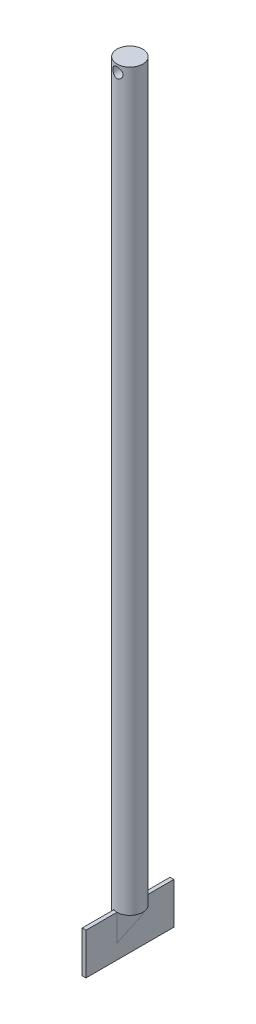
ISO-10303-21;
HEADER;
FILE_DESCRIPTION(('STEP AP214'),'2;1');
FILE_NAME('part.step','',(''),(''),'','','');
FILE_SCHEMA(('AUTOMOTIVE_DESIGN { 1 0 10303 214 1 1 1 1 }'));
ENDSEC;
DATA;
#1=APPLICATION_CONTEXT('core data for automotive mechanical design processes');
#2=APPLICATION_PROTOCOL_DEFINITION('international standard','automotive_design',2000,#1);
#3=PRODUCT_CONTEXT('',#1,'mechanical');
#4=PRODUCT('Part','Part','',(#3));
#5=PRODUCT_RELATED_PRODUCT_CATEGORY('part','',(#4));
#6=PRODUCT_DEFINITION_FORMATION('','',#4);
#7=PRODUCT_DEFINITION_CONTEXT('part definition',#1,'design');
#8=PRODUCT_DEFINITION('design','',#6,#7);
#9=PRODUCT_DEFINITION_SHAPE('','',#8);
#10=(LENGTH_UNIT() NAMED_UNIT(*) SI_UNIT(.MILLI.,.METRE.));
#11=(NAMED_UNIT(*) PLANE_ANGLE_UNIT() SI_UNIT($,.RADIAN.));
#12=(NAMED_UNIT(*) SI_UNIT($,.STERADIAN.) SOLID_ANGLE_UNIT());
#13=UNCERTAINTY_MEASURE_WITH_UNIT(LENGTH_MEASURE(1.E-05),#10,'distance_accuracy_value','');
#14=(GEOMETRIC_REPRESENTATION_CONTEXT(3) GLOBAL_UNCERTAINTY_ASSIGNED_CONTEXT((#13)) GLOBAL_UNIT_ASSIGNED_CONTEXT((#10,
#11,#12)) REPRESENTATION_CONTEXT('',''));
#15=CARTESIAN_POINT('',(0.,0.,0.));
#16=DIRECTION('',(0.,0.,1.));
#17=DIRECTION('',(1.,0.,0.));
#18=AXIS2_PLACEMENT_3D('',#15,#16,#17);
#19=CARTESIAN_POINT('',(-0.7366,8.,-2.5));
#20=DIRECTION('',(0.,1.,0.));
#21=DIRECTION('',(0.,0.,1.));
#22=AXIS2_PLACEMENT_3D('',#19,#20,#21);
#23=PLANE('',#22);
#24=DIRECTION('',(0.,0.,1.));
#25=VECTOR('',#24,1.);
#26=CARTESIAN_POINT('',(0.,8.,-2.5));
#27=LINE('',#26,#25);
#28=CARTESIAN_POINT('',(0.,8.,-8.5));
#29=VERTEX_POINT('',#28);
#30=CARTESIAN_POINT('',(0.,8.,8.5));
#31=VERTEX_POINT('',#30);
#32=EDGE_CURVE('E107',#29,#31,#27,.T.);
#33=ORIENTED_EDGE('',*,*,#32,.F.);
#34=DIRECTION('',(1.,0.,0.));
#35=VECTOR('',#34,1.);
#36=CARTESIAN_POINT('',(-0.7366,8.,-8.5));
#37=LINE('',#36,#35);
#38=CARTESIAN_POINT('',(-0.7366,8.,-8.5));
#39=VERTEX_POINT('',#38);
#40=EDGE_CURVE('E12',#39,#29,#37,.T.);
#41=ORIENTED_EDGE('',*,*,#40,.F.);
#42=DIRECTION('',(0.,0.,1.));
#43=VECTOR('',#42,1.);
#44=CARTESIAN_POINT('',(-0.7366,8.,-2.5));
#45=LINE('',#44,#43);
#46=CARTESIAN_POINT('',(-0.7366,8.,8.5));
#47=VERTEX_POINT('',#46);
#48=EDGE_CURVE('E65',#39,#47,#45,.T.);
#49=ORIENTED_EDGE('',*,*,#48,.T.);
#50=DIRECTION('',(1.,0.,0.));
#51=VECTOR('',#50,1.);
#52=CARTESIAN_POINT('',(-0.7366,8.,8.5));
#53=LINE('',#52,#51);
#54=EDGE_CURVE('E50',#47,#31,#53,.T.);
#55=ORIENTED_EDGE('',*,*,#54,.T.);
#56=EDGE_LOOP('',(#33,#41,#49,#55));
#57=FACE_BOUND('',#56,.T.);
#58=ADVANCED_FACE('F46',(#57),#23,.T.);
#59=CARTESIAN_POINT('',(-0.7366,8.,-8.5));
#60=DIRECTION('',(0.,0.,-1.));
#61=DIRECTION('',(0.,1.,0.));
#62=AXIS2_PLACEMENT_3D('',#59,#60,#61);
#63=PLANE('',#62);
#64=DIRECTION('',(0.,1.,0.));
#65=VECTOR('',#64,1.);
#66=CARTESIAN_POINT('',(0.,8.,-8.5));
#67=LINE('',#66,#65);
#68=CARTESIAN_POINT('',(0.,0.,-8.5));
#69=VERTEX_POINT('',#68);
#70=EDGE_CURVE('E114',#69,#29,#67,.T.);
#71=ORIENTED_EDGE('',*,*,#70,.F.);
#72=DIRECTION('',(1.,0.,0.));
#73=VECTOR('',#72,1.);
#74=CARTESIAN_POINT('',(-0.7366,0.,-8.5));
#75=LINE('',#74,#73);
#76=CARTESIAN_POINT('',(-0.7366,0.,-8.5));
#77=VERTEX_POINT('',#76);
#78=EDGE_CURVE('E56',#77,#69,#75,.T.);
#79=ORIENTED_EDGE('',*,*,#78,.F.);
#80=DIRECTION('',(0.,1.,0.));
#81=VECTOR('',#80,1.);
#82=CARTESIAN_POINT('',(-0.7366,8.,-8.5));
#83=LINE('',#82,#81);
#84=EDGE_CURVE('E104',#77,#39,#83,.T.);
#85=ORIENTED_EDGE('',*,*,#84,.T.);
#86=ORIENTED_EDGE('',*,*,#40,.T.);
#87=EDGE_LOOP('',(#71,#79,#85,#86));
#88=FACE_BOUND('',#87,.T.);
#89=ADVANCED_FACE('F121',(#88),#63,.T.);
#90=CARTESIAN_POINT('',(-0.7366,0.,-2.5));
#91=DIRECTION('',(0.,-1.,0.));
#92=DIRECTION('',(0.,0.,-1.));
#93=AXIS2_PLACEMENT_3D('',#90,#91,#92);
#94=PLANE('',#93);
#95=DIRECTION('',(0.,0.,-1.));
#96=VECTOR('',#95,1.);
#97=CARTESIAN_POINT('',(0.,0.,-2.5));
#98=LINE('',#97,#96);
#99=CARTESIAN_POINT('',(0.,0.,8.5));
#100=VERTEX_POINT('',#99);
#101=EDGE_CURVE('E97',#100,#69,#98,.T.);
#102=ORIENTED_EDGE('',*,*,#101,.F.);
#103=DIRECTION('',(1.,0.,0.));
#104=VECTOR('',#103,1.);
#105=CARTESIAN_POINT('',(-0.7366,0.,8.5));
#106=LINE('',#105,#104);
#107=CARTESIAN_POINT('',(-0.7366,0.,8.5));
#108=VERTEX_POINT('',#107);
#109=EDGE_CURVE('E92',#108,#100,#106,.T.);
#110=ORIENTED_EDGE('',*,*,#109,.F.);
#111=DIRECTION('',(0.,0.,-1.));
#112=VECTOR('',#111,1.);
#113=CARTESIAN_POINT('',(-0.7366,0.,2.5));
#114=LINE('',#113,#112);
#115=EDGE_CURVE('E95',#108,#77,#114,.T.);
#116=ORIENTED_EDGE('',*,*,#115,.T.);
#117=ORIENTED_EDGE('',*,*,#78,.T.);
#118=EDGE_LOOP('',(#102,#110,#116,#117));
#119=FACE_BOUND('',#118,.T.);
#120=ADVANCED_FACE('F94',(#119),#94,.T.);
#121=CARTESIAN_POINT('',(-0.7366,8.,8.5));
#122=DIRECTION('',(0.,0.,1.));
#123=DIRECTION('',(0.,-1.,0.));
#124=AXIS2_PLACEMENT_3D('',#121,#122,#123);
#125=PLANE('',#124);
#126=DIRECTION('',(0.,-1.,0.));
#127=VECTOR('',#126,1.);
#128=CARTESIAN_POINT('',(0.,8.,8.5));
#129=LINE('',#128,#127);
#130=EDGE_CURVE('E111',#31,#100,#129,.T.);
#131=ORIENTED_EDGE('',*,*,#130,.F.);
#132=ORIENTED_EDGE('',*,*,#54,.F.);
#133=DIRECTION('',(0.,-1.,0.));
#134=VECTOR('',#133,1.);
#135=CARTESIAN_POINT('',(-0.7366,8.,8.5));
#136=LINE('',#135,#134);
#137=EDGE_CURVE('E103',#47,#108,#136,.T.);
#138=ORIENTED_EDGE('',*,*,#137,.T.);
#139=ORIENTED_EDGE('',*,*,#109,.T.);
#140=EDGE_LOOP('',(#131,#132,#138,#139));
#141=FACE_BOUND('',#140,.T.);
#142=ADVANCED_FACE('F48',(#141),#125,.T.);
#143=CARTESIAN_POINT('',(-0.7366,0.,0.));
#144=DIRECTION('',(1.,0.,0.));
#145=DIRECTION('',(0.,0.,-1.));
#146=AXIS2_PLACEMENT_3D('',#143,#144,#145);
#147=PLANE('',#146);
#148=ORIENTED_EDGE('',*,*,#48,.F.);
#149=ORIENTED_EDGE('',*,*,#84,.F.);
#150=ORIENTED_EDGE('',*,*,#115,.F.);
#151=ORIENTED_EDGE('',*,*,#137,.F.);
#152=EDGE_LOOP('',(#148,#149,#150,#151));
#153=FACE_BOUND('',#152,.T.);
#154=ADVANCED_FACE('F102',(#153),#147,.F.);
#155=CARTESIAN_POINT('',(0.,0.,0.));
#156=DIRECTION('',(1.,0.,0.));
#157=DIRECTION('',(0.,0.,-1.));
#158=AXIS2_PLACEMENT_3D('',#155,#156,#157);
#159=PLANE('',#158);
#160=ORIENTED_EDGE('',*,*,#32,.T.);
#161=ORIENTED_EDGE('',*,*,#130,.T.);
#162=ORIENTED_EDGE('',*,*,#101,.T.);
#163=ORIENTED_EDGE('',*,*,#70,.T.);
#164=EDGE_LOOP('',(#160,#161,#162,#163));
#165=FACE_BOUND('',#164,.T.);
#166=ADVANCED_FACE('F119',(#165),#159,.T.);
#167=CLOSED_SHELL('',(#58,#89,#120,#142,#154,#166));
#168=MANIFOLD_SOLID_BREP('B2',#167);
#169=CARTESIAN_POINT('',(0.,150.,0.));
#170=DIRECTION('',(0.,-1.,0.));
#171=DIRECTION('',(0.,0.,-1.));
#172=AXIS2_PLACEMENT_3D('',#169,#170,#171);
#173=CYLINDRICAL_SURFACE('',#172,2.5);
#174=CARTESIAN_POINT('',(0.,149.546302439633,-2.5));
#175=CARTESIAN_POINT('',(-0.0527255858637099,149.546305134919,-2.50000207514947));
#176=CARTESIAN_POINT('',(-0.105433553720956,149.542019054617,-2.49831787136044));
#177=CARTESIAN_POINT('',(-0.209265808271871,149.525064407736,-2.49176873235837));
#178=CARTESIAN_POINT('',(-0.26039046358027,149.51239780784,-2.486904543405));
#179=CARTESIAN_POINT('',(-0.359542811859552,149.479204162292,-2.47451488340789));
#180=CARTESIAN_POINT('',(-0.407576557322328,149.458693060762,-2.46699481285942));
#181=CARTESIAN_POINT('',(-0.499515193882727,149.410477326663,-2.45003524165254));
#182=CARTESIAN_POINT('',(-0.543418880950687,149.382770605164,-2.44059518378373));
#183=CARTESIAN_POINT('',(-0.627848869642337,149.319636598682,-2.42028282429554));
#184=CARTESIAN_POINT('',(-0.668162852935495,149.283939311682,-2.40936766532367));
#185=CARTESIAN_POINT('',(-0.742406344818337,149.206410699056,-2.38753701797641));
#186=CARTESIAN_POINT('',(-0.776333650610496,149.16457726586,-2.37662153078133));
#187=CARTESIAN_POINT('',(-0.838248745092324,149.073822527169,-2.35551600890613));
#188=CARTESIAN_POINT('',(-0.865926797699143,149.024677151074,-2.34537577824783));
#189=CARTESIAN_POINT('',(-0.91252924954174,148.921971698756,-2.32764188561281));
#190=CARTESIAN_POINT('',(-0.931457484009226,148.86841356889,-2.3200471083118));
#191=CARTESIAN_POINT('',(-0.959168611328935,148.760854206648,-2.30872521216767));
#192=CARTESIAN_POINT('',(-0.968359064663309,148.706974832296,-2.3048434459503));
#193=CARTESIAN_POINT('',(-0.977607443894245,148.598309486559,-2.3009370899815));
#194=CARTESIAN_POINT('',(-0.977669565179662,148.54352394323,-2.30091072828304));
#195=CARTESIAN_POINT('',(-0.968969369987642,148.438443956723,-2.30458571629504));
#196=CARTESIAN_POINT('',(-0.960787550327517,148.388091237164,-2.30804184697979));
#197=CARTESIAN_POINT('',(-0.936796490446759,148.289540287978,-2.3178823649638));
#198=CARTESIAN_POINT('',(-0.920985999410382,148.241342413082,-2.32426723245749));
#199=CARTESIAN_POINT('',(-0.881890722768155,148.147339432819,-2.33938322459449));
#200=CARTESIAN_POINT('',(-0.858463650339298,148.101600910457,-2.3481584530494));
#201=CARTESIAN_POINT('',(-0.80489979907713,148.014541767039,-2.3670533167478));
#202=CARTESIAN_POINT('',(-0.774760571109112,147.973222766747,-2.37717344217303));
#203=CARTESIAN_POINT('',(-0.70602567101376,147.892984100266,-2.39852318013101));
#204=CARTESIAN_POINT('',(-0.666971641717412,147.854463219023,-2.40977970333551));
#205=CARTESIAN_POINT('',(-0.582834142820546,147.784393389183,-2.43149962142131));
#206=CARTESIAN_POINT('',(-0.537749584958168,147.752845701692,-2.44196287261448));
#207=CARTESIAN_POINT('',(-0.44174345396513,147.69712698137,-2.46115797284338));
#208=CARTESIAN_POINT('',(-0.390731214881055,147.673099368369,-2.46985516287567));
#209=CARTESIAN_POINT('',(-0.284963386266306,147.634102289241,-2.48427814306151));
#210=CARTESIAN_POINT('',(-0.230209620790194,147.61912844383,-2.49000536958759));
#211=CARTESIAN_POINT('',(-0.121860929217056,147.599455168135,-2.49758486012994));
#212=CARTESIAN_POINT('',(-0.068377452128324,147.594219407777,-2.49963914044596));
#213=CARTESIAN_POINT('',(0.038737769294411,147.592595667027,-2.50027300782215));
#214=CARTESIAN_POINT('',(0.0923694741655122,147.596205522941,-2.49885344460689));
#215=CARTESIAN_POINT('',(0.195871282798334,147.611770914155,-2.4928318369117));
#216=CARTESIAN_POINT('',(0.245804453714625,147.623366017249,-2.48836731440514));
#217=CARTESIAN_POINT('',(0.342974714514253,147.654088415175,-2.47684558050765));
#218=CARTESIAN_POINT('',(0.390211454896237,147.673216683901,-2.46978803389615));
#219=CARTESIAN_POINT('',(0.482250505924272,147.719082837662,-2.45350478304062));
#220=CARTESIAN_POINT('',(0.526936218009557,147.746033083683,-2.44422003819379));
#221=CARTESIAN_POINT('',(0.611305583885435,147.806541000349,-2.42449700049908));
#222=CARTESIAN_POINT('',(0.650987278433164,147.840101245939,-2.41405825880566));
#223=CARTESIAN_POINT('',(0.726841247620001,147.915358676814,-2.39235354978379));
#224=CARTESIAN_POINT('',(0.762635073863201,147.957435223587,-2.38107689048087));
#225=CARTESIAN_POINT('',(0.826739834634272,148.04720627105,-2.35958629114122));
#226=CARTESIAN_POINT('',(0.855049766200095,148.0949015235,-2.34937249365614));
#227=CARTESIAN_POINT('',(0.903500527907602,148.195143890844,-2.33117244812269));
#228=CARTESIAN_POINT('',(0.923579108273992,148.247724417483,-2.32320331198817));
#229=CARTESIAN_POINT('',(0.954450500471927,148.355922948213,-2.31069405211934));
#230=CARTESIAN_POINT('',(0.965249735215753,148.411538822913,-2.30615155682316));
#231=CARTESIAN_POINT('',(0.976657044631592,148.52009026205,-2.3013421638154));
#232=CARTESIAN_POINT('',(0.977917512568994,148.572945625426,-2.30080161737245));
#233=CARTESIAN_POINT('',(0.971908793448211,148.678075151295,-2.30334622738509));
#234=CARTESIAN_POINT('',(0.964640568139718,148.730349378648,-2.30643097502953));
#235=CARTESIAN_POINT('',(0.942304421804284,148.830913813956,-2.31564229181697));
#236=CARTESIAN_POINT('',(0.927526274188131,148.879279687546,-2.32165552824063));
#237=CARTESIAN_POINT('',(0.890854768692136,148.972868281698,-2.33597159109709));
#238=CARTESIAN_POINT('',(0.868959544815712,149.018090174174,-2.34427501789878));
#239=CARTESIAN_POINT('',(0.817269077222448,149.106839013707,-2.36280847090191));
#240=CARTESIAN_POINT('',(0.787102893020835,149.150132679846,-2.37311983427258));
#241=CARTESIAN_POINT('',(0.720280965049875,149.231250513625,-2.39424777309725));
#242=CARTESIAN_POINT('',(0.683623072829942,149.269072862964,-2.40506451493262));
#243=CARTESIAN_POINT('',(0.60220417412026,149.340523287063,-2.426773022914));
#244=CARTESIAN_POINT('',(0.557086423540308,149.373757531864,-2.43762950556742));
#245=CARTESIAN_POINT('',(0.461521884618376,149.43217574759,-2.4575147327931));
#246=CARTESIAN_POINT('',(0.411073891484605,149.457357893304,-2.46654306279831));
#247=CARTESIAN_POINT('',(0.30202274574261,149.500411857569,-2.48234666795525));
#248=CARTESIAN_POINT('',(0.243090132163681,149.51754571738,-2.48888653645957));
#249=CARTESIAN_POINT('',(0.1227626870862,149.540485921172,-2.49771067291033));
#250=CARTESIAN_POINT('',(0.0613694094937344,149.546299302483,-2.49999758465088));
#251=CARTESIAN_POINT('',(0.,149.546302439633,-2.5));
#252=B_SPLINE_CURVE_WITH_KNOTS('',3,(#174,#175,#176,#177,#178,#179,#180,#181,#182,#183,#184,
#185,#186,#187,#188,#189,#190,#191,#192,#193,#194,#195,#196,#197,#198,#199,#200,#201,#202,#203,
#204,#205,#206,#207,#208,#209,#210,#211,#212,#213,#214,#215,#216,#217,#218,#219,#220,#221,#222,
#223,#224,#225,#226,#227,#228,#229,#230,#231,#232,#233,#234,#235,#236,#237,#238,#239,#240,#241,
#242,#243,#244,#245,#246,#247,#248,#249,#250,#251),.UNSPECIFIED.,.T.,.F.,(4,2,2,2,2,2,2,2,2,2,2,
2,2,2,2,2,2,2,2,2,2,2,2,2,2,2,2,2,2,2,2,2,2,2,2,2,2,2,4),(0.,0.157950221456324,
0.315863389409176,0.473457286638105,0.631096985514476,0.795200893189135,0.959361297845935,
1.13042444292897,1.30141253612726,1.46492127773109,1.62835487034874,1.78103234928357,
1.93373487010487,2.08947192100586,2.24526589069572,2.41249633822824,2.57975700478104,
2.75003658687801,2.9202337391548,3.08074279441132,3.24121259204071,3.39487687988287,
3.5485610401062,3.70688637436592,3.86527350716387,4.03363639153214,4.20202182780474,
4.37165818173339,4.54117702315817,4.69898701563052,4.85677921415448,5.00889914571545,
5.16105899318131,5.32166182467624,5.48231790784161,5.6527236469008,5.82316798540797,
6.00712693337162,6.19097148742239),.UNSPECIFIED.);
#253=CARTESIAN_POINT('',(0.,149.546302439633,-2.5));
#254=VERTEX_POINT('',#253);
#255=EDGE_CURVE('E197',#254,#254,#252,.T.);
#256=ORIENTED_EDGE('',*,*,#255,.T.);
#257=EDGE_LOOP('',(#256));
#258=FACE_BOUND('',#257,.T.);
#259=CARTESIAN_POINT('',(0.976503682379007,148.569798757254,2.30139969546801));
#260=CARTESIAN_POINT('',(0.9765065296755,148.517247252838,2.30139691570582));
#261=CARTESIAN_POINT('',(0.972247556914325,148.464713514241,2.30321912984066));
#262=CARTESIAN_POINT('',(0.955410484519691,148.361240504659,2.31025401782326));
#263=CARTESIAN_POINT('',(0.942833146694824,148.310301088109,2.31546638119524));
#264=CARTESIAN_POINT('',(0.90989998788487,148.211544288095,2.3286029500782));
#265=CARTESIAN_POINT('',(0.889564245688425,148.163719215627,2.33652014997668));
#266=CARTESIAN_POINT('',(0.841763452299874,148.072140410918,2.35416257237353));
#267=CARTESIAN_POINT('',(0.814296080671266,148.028388010118,2.36388838305138));
#268=CARTESIAN_POINT('',(0.751422678581425,147.943832570045,2.38464055254968));
#269=CARTESIAN_POINT('',(0.715692824369883,147.903280174777,2.39570733793976));
#270=CARTESIAN_POINT('',(0.637994163733929,147.828564056872,2.41755886473486));
#271=CARTESIAN_POINT('',(0.596023880607184,147.794401850708,2.42834353867026));
#272=CARTESIAN_POINT('',(0.505104904189637,147.73219934833,2.44890138626625));
#273=CARTESIAN_POINT('',(0.455954061487306,147.70443548729,2.45862170938497));
#274=CARTESIAN_POINT('',(0.353231840986707,147.657676177911,2.47546566116713));
#275=CARTESIAN_POINT('',(0.29966214644167,147.638677408742,2.48259027305221));
#276=CARTESIAN_POINT('',(0.192260701425537,147.610878670276,2.49315273733058));
#277=CARTESIAN_POINT('',(0.13855648928989,147.601646306871,2.49674634268025));
#278=CARTESIAN_POINT('',(0.0302487601525063,147.592252732468,2.50040332393249));
#279=CARTESIAN_POINT('',(-0.0243544326829557,147.592088320315,2.50046794563214));
#280=CARTESIAN_POINT('',(-0.129794848402138,147.600592656457,2.49715608633548));
#281=CARTESIAN_POINT('',(-0.180677044177786,147.608788376173,2.4939638797448));
#282=CARTESIAN_POINT('',(-0.280277447156096,147.632979134401,2.48474287576476));
#283=CARTESIAN_POINT('',(-0.328995499689578,147.648974729386,2.4787138759884));
#284=CARTESIAN_POINT('',(-0.42375072995786,147.688509722915,2.46429873602982));
#285=CARTESIAN_POINT('',(-0.469737110400212,147.712158035124,2.45587879379678));
#286=CARTESIAN_POINT('',(-0.557206042944196,147.766227413458,2.43752367912033));
#287=CARTESIAN_POINT('',(-0.598687073641065,147.796650756919,2.42758799753587));
#288=CARTESIAN_POINT('',(-0.678738687219941,147.865641257682,2.40647756972329));
#289=CARTESIAN_POINT('',(-0.716961676999293,147.904600511224,2.3952641965311));
#290=CARTESIAN_POINT('',(-0.786469792402254,147.988429081279,2.37335130685343));
#291=CARTESIAN_POINT('',(-0.817752858392419,148.033300146021,2.36265194365217));
#292=CARTESIAN_POINT('',(-0.873237036450871,148.129162349113,2.34272305662603));
#293=CARTESIAN_POINT('',(-0.897234165896511,148.180281711908,2.33353868004489));
#294=CARTESIAN_POINT('',(-0.936143606472852,148.286290011077,2.31820571842935));
#295=CARTESIAN_POINT('',(-0.951061492403693,148.341176611221,2.31205527095471));
#296=CARTESIAN_POINT('',(-0.97056445424844,148.449705203117,2.30393368310907));
#297=CARTESIAN_POINT('',(-0.975706316742879,148.503230127302,2.30173774398338));
#298=CARTESIAN_POINT('',(-0.977128558949951,148.610411344668,2.30113483166285));
#299=CARTESIAN_POINT('',(-0.973411436368171,148.664067596561,2.30272679050641));
#300=CARTESIAN_POINT('',(-0.957727421752044,148.766988786496,2.30929048790491));
#301=CARTESIAN_POINT('',(-0.94621025687715,148.816335433659,2.31407778556264));
#302=CARTESIAN_POINT('',(-0.915829751751367,148.912367142482,2.32626778437562));
#303=CARTESIAN_POINT('',(-0.896964829736704,148.959051628573,2.33367104864245));
#304=CARTESIAN_POINT('',(-0.851590943482547,149.050485208956,2.35061687934988));
#305=CARTESIAN_POINT('',(-0.824809806218901,149.095085319602,2.36023231324752));
#306=CARTESIAN_POINT('',(-0.764646201195046,149.179354637205,2.38040367778104));
#307=CARTESIAN_POINT('',(-0.731261145956298,149.219021901473,2.3909599761631));
#308=CARTESIAN_POINT('',(-0.656083474069767,149.295175748267,2.41271377243651));
#309=CARTESIAN_POINT('',(-0.613866623549216,149.331246966999,2.42390458658785));
#310=CARTESIAN_POINT('',(-0.523708546772247,149.395851885669,2.44496825337553));
#311=CARTESIAN_POINT('',(-0.475767175205116,149.42438539421,2.45484107254252));
#312=CARTESIAN_POINT('',(-0.375433941754872,149.472964787313,2.47217188412227));
#313=CARTESIAN_POINT('',(-0.323049236890884,149.493024021242,2.47963367019644));
#314=CARTESIAN_POINT('',(-0.215287680231275,149.523920327067,2.49130118866825));
#315=CARTESIAN_POINT('',(-0.159912385589023,149.534762150017,2.4955085984114));
#316=CARTESIAN_POINT('',(-0.0514801300280754,149.5463716652,2.50002192022977));
#317=CARTESIAN_POINT('',(0.00150487291400754,149.547727668594,2.50055563904421));
#318=CARTESIAN_POINT('',(0.106918960786326,149.541865240615,2.49826864999334));
#319=CARTESIAN_POINT('',(0.15934812171216,149.53464799705,2.49544840681325));
#320=CARTESIAN_POINT('',(0.260649937624669,149.512262153761,2.48688072058672));
#321=CARTESIAN_POINT('',(0.309581210724297,149.497323779119,2.48121816238811));
#322=CARTESIAN_POINT('',(0.404239136193215,149.460156646826,2.46756557843197));
#323=CARTESIAN_POINT('',(0.44996518072958,149.437926510895,2.45957511268831));
#324=CARTESIAN_POINT('',(0.539097045824807,149.385713324803,2.44162471640495));
#325=CARTESIAN_POINT('',(0.582315506019871,149.355435175156,2.43159425322597));
#326=CARTESIAN_POINT('',(0.663234295181685,149.288437401005,2.41078178494764));
#327=CARTESIAN_POINT('',(0.700932587599022,149.251715410111,2.39999950463596));
#328=CARTESIAN_POINT('',(0.772014022769588,149.170331033123,2.3781207211894));
#329=CARTESIAN_POINT('',(0.805017094787209,149.125330382716,2.36704258619123));
#330=CARTESIAN_POINT('',(0.863025963097018,149.030077214571,2.34651576848963));
#331=CARTESIAN_POINT('',(0.888029560299285,148.979823257706,2.33706753418125));
#332=CARTESIAN_POINT('',(0.930826927170906,148.871124090756,2.32037438860736));
#333=CARTESIAN_POINT('',(0.947877652378092,148.812345137576,2.31336827855277));
#334=CARTESIAN_POINT('',(0.97070967605285,148.692300923499,2.30388443813614));
#335=CARTESIAN_POINT('',(0.976500364383638,148.631037777763,2.30140293476469));
#336=CARTESIAN_POINT('',(0.976503682379007,148.569798757254,2.30139969546801));
#337=B_SPLINE_CURVE_WITH_KNOTS('',3,(#259,#260,#261,#262,#263,#264,#265,#266,#267,#268,#269,
#270,#271,#272,#273,#274,#275,#276,#277,#278,#279,#280,#281,#282,#283,#284,#285,#286,#287,#288,
#289,#290,#291,#292,#293,#294,#295,#296,#297,#298,#299,#300,#301,#302,#303,#304,#305,#306,#307,
#308,#309,#310,#311,#312,#313,#314,#315,#316,#317,#318,#319,#320,#321,#322,#323,#324,#325,#326,
#327,#328,#329,#330,#331,#332,#333,#334,#335,#336),.UNSPECIFIED.,.T.,.F.,(4,2,2,2,2,2,2,2,2,2,2,
2,2,2,2,2,2,2,2,2,2,2,2,2,2,2,2,2,2,2,2,2,2,2,2,2,2,2,4),(0.,0.157425996483152,
0.314837577648852,0.471844510402868,0.628902593063048,0.793679847127333,0.958496155455104,
1.1294707239967,1.30038046209652,1.46335850153365,1.62627900630949,1.7804661675881,
1.93466433079977,2.09116140328167,2.24771115978415,2.41411578945643,2.58056973889105,
2.75132671550737,2.92197873856281,3.08258060418704,3.24313719501765,3.39514624956382,
3.54718804545154,3.70522727476765,3.86332854846206,4.03246695412185,4.20160965408838,
4.37048490410587,4.53927305563989,4.69749202717753,4.85568908032314,5.00942010502945,
5.16318020453762,5.32362656144945,5.48413196332325,5.65400155739521,5.82391780930121,
6.00752175199834,6.19097251966311),.UNSPECIFIED.);
#338=CARTESIAN_POINT('',(0.976503682379007,148.569798757254,2.30139969546801));
#339=VERTEX_POINT('',#338);
#340=EDGE_CURVE('E237',#339,#339,#337,.T.);
#341=ORIENTED_EDGE('',*,*,#340,.T.);
#342=EDGE_LOOP('',(#341));
#343=FACE_BOUND('',#342,.T.);
#344=CARTESIAN_POINT('',(0.,150.,0.));
#345=DIRECTION('',(0.,1.,0.));
#346=DIRECTION('',(0.,0.,1.));
#347=AXIS2_PLACEMENT_3D('',#344,#345,#346);
#348=CIRCLE('',#347,2.5);
#349=CARTESIAN_POINT('',(0.,150.,2.5));
#350=VERTEX_POINT('',#349);
#351=EDGE_CURVE('E44',#350,#350,#348,.T.);
#352=ORIENTED_EDGE('',*,*,#351,.F.);
#353=EDGE_LOOP('',(#352));
#354=FACE_BOUND('',#353,.T.);
#355=CARTESIAN_POINT('',(0.,8.,0.));
#356=DIRECTION('',(0.,-1.,0.));
#357=DIRECTION('',(0.,0.,-1.));
#358=AXIS2_PLACEMENT_3D('',#355,#356,#357);
#359=CIRCLE('',#358,2.5);
#360=CARTESIAN_POINT('',(0.,8.,-2.5));
#361=VERTEX_POINT('',#360);
#362=CARTESIAN_POINT('',(0.,8.,2.5));
#363=VERTEX_POINT('',#362);
#364=EDGE_CURVE('E229',#361,#363,#359,.T.);
#365=ORIENTED_EDGE('',*,*,#364,.F.);
#366=DIRECTION('',(0.,-1.,0.));
#367=VECTOR('',#366,1.);
#368=CARTESIAN_POINT('',(0.,8.,-2.5));
#369=LINE('',#368,#367);
#370=CARTESIAN_POINT('',(0.,0.,-2.5));
#371=VERTEX_POINT('',#370);
#372=EDGE_CURVE('E219',#361,#371,#369,.T.);
#373=ORIENTED_EDGE('',*,*,#372,.T.);
#374=CARTESIAN_POINT('',(0.,0.,0.));
#375=DIRECTION('',(0.,1.,0.));
#376=DIRECTION('',(0.,0.,1.));
#377=AXIS2_PLACEMENT_3D('',#374,#375,#376);
#378=CIRCLE('',#377,2.5);
#379=CARTESIAN_POINT('',(0.,0.,2.5));
#380=VERTEX_POINT('',#379);
#381=EDGE_CURVE('E205',#371,#380,#378,.T.);
#382=ORIENTED_EDGE('',*,*,#381,.T.);
#383=DIRECTION('',(0.,-1.,0.));
#384=VECTOR('',#383,1.);
#385=CARTESIAN_POINT('',(0.,8.,2.5));
#386=LINE('',#385,#384);
#387=EDGE_CURVE('E213',#363,#380,#386,.T.);
#388=ORIENTED_EDGE('',*,*,#387,.F.);
#389=EDGE_LOOP('',(#365,#373,#382,#388));
#390=FACE_BOUND('',#389,.T.);
#391=ADVANCED_FACE('F193',(#258,#343,#354,#390),#173,.T.);
#392=CARTESIAN_POINT('',(0.,150.,0.));
#393=DIRECTION('',(0.,1.,0.));
#394=DIRECTION('',(0.,0.,1.));
#395=AXIS2_PLACEMENT_3D('',#392,#393,#394);
#396=PLANE('',#395);
#397=ORIENTED_EDGE('',*,*,#351,.T.);
#398=EDGE_LOOP('',(#397));
#399=FACE_BOUND('',#398,.T.);
#400=ADVANCED_FACE('F253',(#399),#396,.T.);
#401=CARTESIAN_POINT('',(0.,0.,0.));
#402=DIRECTION('',(0.,1.,0.));
#403=DIRECTION('',(0.,0.,1.));
#404=AXIS2_PLACEMENT_3D('',#401,#402,#403);
#405=PLANE('',#404);
#406=ORIENTED_EDGE('',*,*,#381,.F.);
#407=DIRECTION('',(0.,0.,-1.));
#408=VECTOR('',#407,1.);
#409=CARTESIAN_POINT('',(0.,0.,-2.5));
#410=LINE('',#409,#408);
#411=EDGE_CURVE('E224',#380,#371,#410,.T.);
#412=ORIENTED_EDGE('',*,*,#411,.F.);
#413=EDGE_LOOP('',(#406,#412));
#414=FACE_BOUND('',#413,.T.);
#415=ADVANCED_FACE('F234',(#414),#405,.F.);
#416=CARTESIAN_POINT('',(0.,8.,-2.5));
#417=DIRECTION('',(-1.,0.,0.));
#418=DIRECTION('',(0.,0.,1.));
#419=AXIS2_PLACEMENT_3D('',#416,#417,#418);
#420=PLANE('',#419);
#421=ORIENTED_EDGE('',*,*,#411,.T.);
#422=ORIENTED_EDGE('',*,*,#372,.F.);
#423=DIRECTION('',(0.,0.,-1.));
#424=VECTOR('',#423,1.);
#425=CARTESIAN_POINT('',(0.,8.,-2.5));
#426=LINE('',#425,#424);
#427=EDGE_CURVE('E302',#363,#361,#426,.T.);
#428=ORIENTED_EDGE('',*,*,#427,.F.);
#429=ORIENTED_EDGE('',*,*,#387,.T.);
#430=EDGE_LOOP('',(#421,#422,#428,#429));
#431=FACE_BOUND('',#430,.T.);
#432=ADVANCED_FACE('F225',(#431),#420,.F.);
#433=CARTESIAN_POINT('',(0.,8.,0.));
#434=DIRECTION('',(0.,-1.,0.));
#435=DIRECTION('',(0.,0.,-1.));
#436=AXIS2_PLACEMENT_3D('',#433,#434,#435);
#437=PLANE('',#436);
#438=ORIENTED_EDGE('',*,*,#364,.T.);
#439=ORIENTED_EDGE('',*,*,#427,.T.);
#440=EDGE_LOOP('',(#438,#439));
#441=FACE_BOUND('',#440,.T.);
#442=ADVANCED_FACE('F245',(#441),#437,.T.);
#443=CARTESIAN_POINT('',(0.,148.569798757254,-8.5));
#444=DIRECTION('',(0.,0.,1.));
#445=DIRECTION('',(1.,0.,0.));
#446=AXIS2_PLACEMENT_3D('',#443,#444,#445);
#447=CYLINDRICAL_SURFACE('',#446,0.976503682379007);
#448=ORIENTED_EDGE('',*,*,#340,.F.);
#449=EDGE_LOOP('',(#448));
#450=FACE_BOUND('',#449,.T.);
#451=ORIENTED_EDGE('',*,*,#255,.F.);
#452=EDGE_LOOP('',(#451));
#453=FACE_BOUND('',#452,.T.);
#454=ADVANCED_FACE('F241',(#450,#453),#447,.F.);
#455=CLOSED_SHELL('',(#391,#400,#415,#432,#442,#454));
#456=MANIFOLD_SOLID_BREP('B6',#455);
#457=ADVANCED_BREP_SHAPE_REPRESENTATION('',(#18,#168,#456),#14);
#458=SHAPE_DEFINITION_REPRESENTATION(#9,#457);
ENDSEC;
END-ISO-10303-21;
